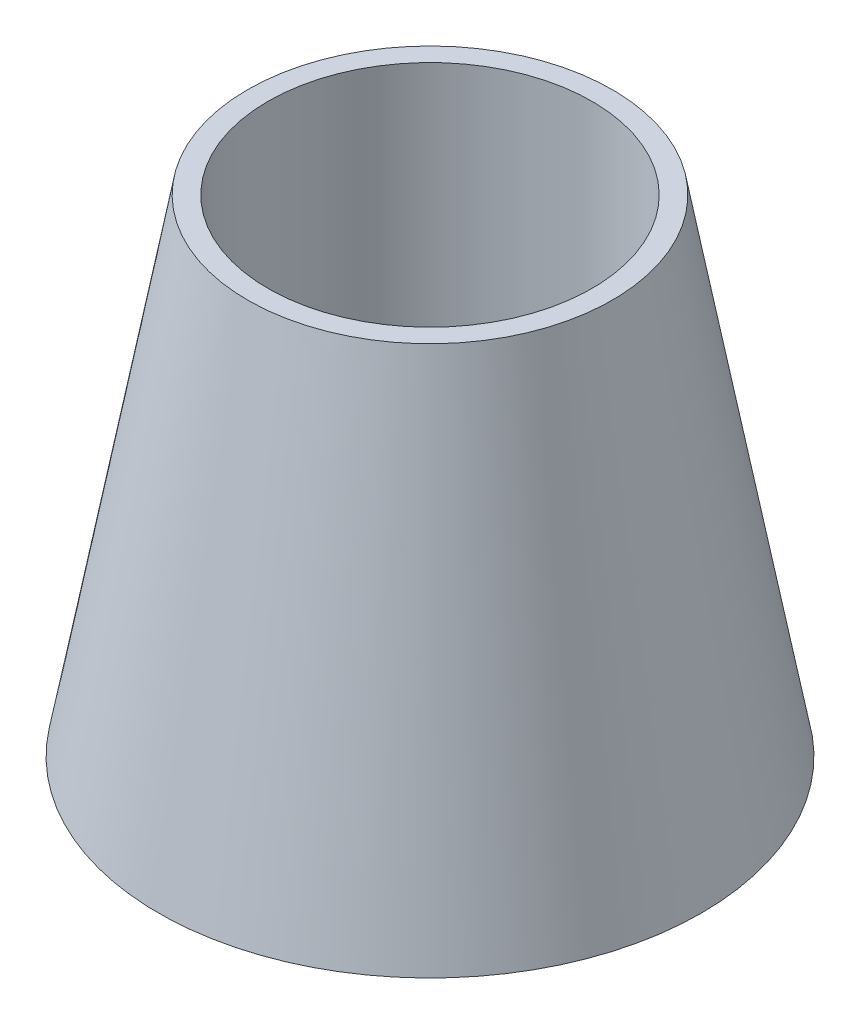
ISO-10303-21;
HEADER;
FILE_DESCRIPTION(('STEP AP214'),'2;1');
FILE_NAME('part.step','',(''),(''),'','','');
FILE_SCHEMA(('AUTOMOTIVE_DESIGN { 1 0 10303 214 1 1 1 1 }'));
ENDSEC;
DATA;
#1=APPLICATION_CONTEXT('core data for automotive mechanical design processes');
#2=APPLICATION_PROTOCOL_DEFINITION('international standard','automotive_design',2000,#1);
#3=PRODUCT_CONTEXT('',#1,'mechanical');
#4=PRODUCT('Part','Part','',(#3));
#5=PRODUCT_RELATED_PRODUCT_CATEGORY('part','',(#4));
#6=PRODUCT_DEFINITION_FORMATION('','',#4);
#7=PRODUCT_DEFINITION_CONTEXT('part definition',#1,'design');
#8=PRODUCT_DEFINITION('design','',#6,#7);
#9=PRODUCT_DEFINITION_SHAPE('','',#8);
#10=(LENGTH_UNIT() NAMED_UNIT(*) SI_UNIT(.MILLI.,.METRE.));
#11=(NAMED_UNIT(*) PLANE_ANGLE_UNIT() SI_UNIT($,.RADIAN.));
#12=(NAMED_UNIT(*) SI_UNIT($,.STERADIAN.) SOLID_ANGLE_UNIT());
#13=UNCERTAINTY_MEASURE_WITH_UNIT(LENGTH_MEASURE(1.E-05),#10,'distance_accuracy_value','');
#14=(GEOMETRIC_REPRESENTATION_CONTEXT(3) GLOBAL_UNCERTAINTY_ASSIGNED_CONTEXT((#13)) GLOBAL_UNIT_ASSIGNED_CONTEXT((#10,
#11,#12)) REPRESENTATION_CONTEXT('',''));
#15=CARTESIAN_POINT('',(0.,0.,0.));
#16=DIRECTION('',(0.,0.,1.));
#17=DIRECTION('',(1.,0.,0.));
#18=AXIS2_PLACEMENT_3D('',#15,#16,#17);
#19=CARTESIAN_POINT('',(0.,6.35000000000001,0.));
#20=DIRECTION('',(0.,1.,0.));
#21=DIRECTION('',(-1.,0.,0.));
#22=AXIS2_PLACEMENT_3D('',#19,#20,#21);
#23=PLANE('',#22);
#24=CARTESIAN_POINT('',(-25.4,6.35000000000001,0.));
#25=DIRECTION('',(0.,1.,0.));
#26=DIRECTION('',(-1.,0.,0.));
#27=AXIS2_PLACEMENT_3D('',#24,#25,#26);
#28=CIRCLE('',#27,3.175);
#29=CARTESIAN_POINT('',(-28.575,6.35000000000001,0.));
#30=VERTEX_POINT('',#29);
#31=EDGE_CURVE('E82',#30,#30,#28,.T.);
#32=ORIENTED_EDGE('',*,*,#31,.F.);
#33=EDGE_LOOP('',(#32));
#34=FACE_BOUND('',#33,.T.);
#35=CARTESIAN_POINT('',(25.4,6.35000000000001,0.));
#36=DIRECTION('',(0.,1.,0.));
#37=DIRECTION('',(-1.,0.,0.));
#38=AXIS2_PLACEMENT_3D('',#35,#36,#37);
#39=CIRCLE('',#38,3.175);
#40=CARTESIAN_POINT('',(22.225,6.35000000000001,0.));
#41=VERTEX_POINT('',#40);
#42=EDGE_CURVE('E76',#41,#41,#39,.T.);
#43=ORIENTED_EDGE('',*,*,#42,.F.);
#44=EDGE_LOOP('',(#43));
#45=FACE_BOUND('',#44,.T.);
#46=CARTESIAN_POINT('',(0.,6.35000000000001,0.));
#47=DIRECTION('',(0.,1.,0.));
#48=DIRECTION('',(-1.,0.,0.));
#49=AXIS2_PLACEMENT_3D('',#46,#47,#48);
#50=CIRCLE('',#49,3.175);
#51=CARTESIAN_POINT('',(-3.175,6.35000000000001,0.));
#52=VERTEX_POINT('',#51);
#53=EDGE_CURVE('E72',#52,#52,#50,.T.);
#54=ORIENTED_EDGE('',*,*,#53,.F.);
#55=EDGE_LOOP('',(#54));
#56=FACE_BOUND('',#55,.T.);
#57=CARTESIAN_POINT('',(0.,6.34999999999999,0.));
#58=DIRECTION('',(0.,1.,0.));
#59=DIRECTION('',(-1.,0.,0.));
#60=AXIS2_PLACEMENT_3D('',#57,#58,#59);
#61=CIRCLE('',#60,48.26);
#62=CARTESIAN_POINT('',(-48.26,6.34999999999999,0.));
#63=VERTEX_POINT('',#62);
#64=EDGE_CURVE('E10',#63,#63,#61,.T.);
#65=ORIENTED_EDGE('',*,*,#64,.T.);
#66=EDGE_LOOP('',(#65));
#67=FACE_BOUND('',#66,.T.);
#68=ADVANCED_FACE('F34',(#34,#45,#56,#67),#23,.T.);
#69=CARTESIAN_POINT('',(0.,8.89,0.));
#70=DIRECTION('',(0.,1.,0.));
#71=DIRECTION('',(-1.,0.,0.));
#72=AXIS2_PLACEMENT_3D('',#69,#70,#71);
#73=TOROIDAL_SURFACE('',#72,48.26,2.54);
#74=CARTESIAN_POINT('',(0.,8.89000000000001,0.));
#75=DIRECTION('',(0.,1.,0.));
#76=DIRECTION('',(-1.,0.,0.));
#77=AXIS2_PLACEMENT_3D('',#74,#75,#76);
#78=CIRCLE('',#77,50.8);
#79=CARTESIAN_POINT('',(-50.8,8.89,0.));
#80=VERTEX_POINT('',#79);
#81=EDGE_CURVE('E41',#80,#80,#78,.T.);
#82=ORIENTED_EDGE('',*,*,#81,.T.);
#83=EDGE_LOOP('',(#82));
#84=FACE_BOUND('',#83,.T.);
#85=ORIENTED_EDGE('',*,*,#64,.F.);
#86=EDGE_LOOP('',(#85));
#87=FACE_BOUND('',#86,.T.);
#88=ADVANCED_FACE('F95',(#84,#87),#73,.F.);
#89=CARTESIAN_POINT('',(0.,152.4,0.));
#90=DIRECTION('',(0.,1.,0.));
#91=DIRECTION('',(-1.,0.,0.));
#92=AXIS2_PLACEMENT_3D('',#89,#90,#91);
#93=CYLINDRICAL_SURFACE('',#92,50.8);
#94=CARTESIAN_POINT('',(0.,152.4,0.));
#95=DIRECTION('',(0.,1.,0.));
#96=DIRECTION('',(-1.,0.,0.));
#97=AXIS2_PLACEMENT_3D('',#94,#95,#96);
#98=CIRCLE('',#97,50.8);
#99=CARTESIAN_POINT('',(-50.8,152.4,0.));
#100=VERTEX_POINT('',#99);
#101=EDGE_CURVE('E45',#100,#100,#98,.T.);
#102=ORIENTED_EDGE('',*,*,#101,.T.);
#103=EDGE_LOOP('',(#102));
#104=FACE_BOUND('',#103,.T.);
#105=ORIENTED_EDGE('',*,*,#81,.F.);
#106=EDGE_LOOP('',(#105));
#107=FACE_BOUND('',#106,.T.);
#108=ADVANCED_FACE('F144',(#104,#107),#93,.F.);
#109=CARTESIAN_POINT('',(-57.15,152.4,0.));
#110=DIRECTION('',(0.,1.,0.));
#111=DIRECTION('',(-1.,0.,0.));
#112=AXIS2_PLACEMENT_3D('',#109,#110,#111);
#113=PLANE('',#112);
#114=CARTESIAN_POINT('',(0.,152.4,0.));
#115=DIRECTION('',(0.,1.,0.));
#116=DIRECTION('',(-1.,0.,0.));
#117=AXIS2_PLACEMENT_3D('',#114,#115,#116);
#118=CIRCLE('',#117,57.15);
#119=CARTESIAN_POINT('',(-57.15,152.4,0.));
#120=VERTEX_POINT('',#119);
#121=EDGE_CURVE('E49',#120,#120,#118,.T.);
#122=ORIENTED_EDGE('',*,*,#121,.T.);
#123=EDGE_LOOP('',(#122));
#124=FACE_BOUND('',#123,.T.);
#125=ORIENTED_EDGE('',*,*,#101,.F.);
#126=EDGE_LOOP('',(#125));
#127=FACE_BOUND('',#126,.T.);
#128=ADVANCED_FACE('F140',(#124,#127),#113,.T.);
#129=CARTESIAN_POINT('',(0.,152.4,0.));
#130=DIRECTION('',(0.,-1.,0.));
#131=DIRECTION('',(1.,0.,0.));
#132=AXIS2_PLACEMENT_3D('',#129,#130,#131);
#133=CONICAL_SURFACE('',#132,57.15,0.18131977440149);
#134=CARTESIAN_POINT('',(0.,0.,0.));
#135=DIRECTION('',(0.,1.,0.));
#136=DIRECTION('',(-1.,0.,0.));
#137=AXIS2_PLACEMENT_3D('',#134,#135,#136);
#138=CIRCLE('',#137,85.09);
#139=CARTESIAN_POINT('',(-85.09,0.,0.));
#140=VERTEX_POINT('',#139);
#141=EDGE_CURVE('E54',#140,#140,#138,.T.);
#142=ORIENTED_EDGE('',*,*,#141,.T.);
#143=EDGE_LOOP('',(#142));
#144=FACE_BOUND('',#143,.T.);
#145=ORIENTED_EDGE('',*,*,#121,.F.);
#146=EDGE_LOOP('',(#145));
#147=FACE_BOUND('',#146,.T.);
#148=ADVANCED_FACE('F111',(#144,#147),#133,.T.);
#149=CARTESIAN_POINT('',(0.,0.,0.));
#150=DIRECTION('',(0.,-1.,0.));
#151=DIRECTION('',(1.,0.,0.));
#152=AXIS2_PLACEMENT_3D('',#149,#150,#151);
#153=PLANE('',#152);
#154=CARTESIAN_POINT('',(-25.4,0.,0.));
#155=DIRECTION('',(0.,-1.,0.));
#156=DIRECTION('',(1.,0.,0.));
#157=AXIS2_PLACEMENT_3D('',#154,#155,#156);
#158=CIRCLE('',#157,3.175);
#159=CARTESIAN_POINT('',(-22.225,0.,0.));
#160=VERTEX_POINT('',#159);
#161=EDGE_CURVE('E79',#160,#160,#158,.F.);
#162=ORIENTED_EDGE('',*,*,#161,.T.);
#163=EDGE_LOOP('',(#162));
#164=FACE_BOUND('',#163,.T.);
#165=CARTESIAN_POINT('',(25.4,0.,0.));
#166=DIRECTION('',(0.,-1.,0.));
#167=DIRECTION('',(1.,0.,0.));
#168=AXIS2_PLACEMENT_3D('',#165,#166,#167);
#169=CIRCLE('',#168,3.175);
#170=CARTESIAN_POINT('',(28.575,0.,0.));
#171=VERTEX_POINT('',#170);
#172=EDGE_CURVE('E85',#171,#171,#169,.F.);
#173=ORIENTED_EDGE('',*,*,#172,.T.);
#174=EDGE_LOOP('',(#173));
#175=FACE_BOUND('',#174,.T.);
#176=CARTESIAN_POINT('',(0.,0.,0.));
#177=DIRECTION('',(0.,-1.,0.));
#178=DIRECTION('',(1.,0.,0.));
#179=AXIS2_PLACEMENT_3D('',#176,#177,#178);
#180=CIRCLE('',#179,3.175);
#181=CARTESIAN_POINT('',(3.175,0.,0.));
#182=VERTEX_POINT('',#181);
#183=EDGE_CURVE('E73',#182,#182,#180,.F.);
#184=ORIENTED_EDGE('',*,*,#183,.T.);
#185=EDGE_LOOP('',(#184));
#186=FACE_BOUND('',#185,.T.);
#187=ORIENTED_EDGE('',*,*,#141,.F.);
#188=EDGE_LOOP('',(#187));
#189=FACE_BOUND('',#188,.T.);
#190=ADVANCED_FACE('F101',(#164,#175,#186,#189),#153,.T.);
#191=CARTESIAN_POINT('',(0.,-0.00100000000001748,0.));
#192=DIRECTION('',(0.,1.,0.));
#193=DIRECTION('',(-1.,0.,0.));
#194=AXIS2_PLACEMENT_3D('',#191,#192,#193);
#195=CYLINDRICAL_SURFACE('',#194,3.175);
#196=ORIENTED_EDGE('',*,*,#183,.F.);
#197=EDGE_LOOP('',(#196));
#198=FACE_BOUND('',#197,.T.);
#199=ORIENTED_EDGE('',*,*,#53,.T.);
#200=EDGE_LOOP('',(#199));
#201=FACE_BOUND('',#200,.T.);
#202=ADVANCED_FACE('F99',(#198,#201),#195,.F.);
#203=CARTESIAN_POINT('',(25.4,-0.00100000000001488,0.));
#204=DIRECTION('',(0.,1.,0.));
#205=DIRECTION('',(-1.,0.,0.));
#206=AXIS2_PLACEMENT_3D('',#203,#204,#205);
#207=CYLINDRICAL_SURFACE('',#206,3.175);
#208=ORIENTED_EDGE('',*,*,#172,.F.);
#209=EDGE_LOOP('',(#208));
#210=FACE_BOUND('',#209,.T.);
#211=ORIENTED_EDGE('',*,*,#42,.T.);
#212=EDGE_LOOP('',(#211));
#213=FACE_BOUND('',#212,.T.);
#214=ADVANCED_FACE('F91',(#210,#213),#207,.F.);
#215=CARTESIAN_POINT('',(-25.4,-0.00100000000002008,0.));
#216=DIRECTION('',(0.,1.,0.));
#217=DIRECTION('',(-1.,0.,0.));
#218=AXIS2_PLACEMENT_3D('',#215,#216,#217);
#219=CYLINDRICAL_SURFACE('',#218,3.175);
#220=ORIENTED_EDGE('',*,*,#161,.F.);
#221=EDGE_LOOP('',(#220));
#222=FACE_BOUND('',#221,.T.);
#223=ORIENTED_EDGE('',*,*,#31,.T.);
#224=EDGE_LOOP('',(#223));
#225=FACE_BOUND('',#224,.T.);
#226=ADVANCED_FACE('F108',(#222,#225),#219,.F.);
#227=CLOSED_SHELL('',(#68,#88,#108,#128,#148,#190,#202,#214,#226));
#228=CARTESIAN_POINT('',(0.,117.763636363636,0.));
#229=DIRECTION('',(0.,-1.,0.));
#230=DIRECTION('',(1.,0.,0.));
#231=AXIS2_PLACEMENT_3D('',#228,#229,#230);
#232=CONICAL_SURFACE('',#231,57.15,0.18131977440149);
#233=CARTESIAN_POINT('',(0.,9.34803278688526,0.));
#234=DIRECTION('',(0.,1.,0.));
#235=DIRECTION('',(-1.,0.,0.));
#236=AXIS2_PLACEMENT_3D('',#233,#234,#235);
#237=CIRCLE('',#236,77.026193989071);
#238=CARTESIAN_POINT('',(-77.026193989071,9.34803278688525,0.));
#239=VERTEX_POINT('',#238);
#240=EDGE_CURVE('E69',#239,#239,#237,.T.);
#241=ORIENTED_EDGE('',*,*,#240,.F.);
#242=EDGE_LOOP('',(#241));
#243=FACE_BOUND('',#242,.T.);
#244=CARTESIAN_POINT('',(0.,117.763636363636,0.));
#245=DIRECTION('',(0.,1.,0.));
#246=DIRECTION('',(-1.,0.,0.));
#247=AXIS2_PLACEMENT_3D('',#244,#245,#246);
#248=CIRCLE('',#247,57.15);
#249=CARTESIAN_POINT('',(-57.15,117.763636363636,0.));
#250=VERTEX_POINT('',#249);
#251=EDGE_CURVE('E57',#250,#250,#248,.T.);
#252=ORIENTED_EDGE('',*,*,#251,.T.);
#253=EDGE_LOOP('',(#252));
#254=FACE_BOUND('',#253,.T.);
#255=ADVANCED_FACE('F133',(#243,#254),#232,.F.);
#256=CARTESIAN_POINT('',(0.,152.4,0.));
#257=DIRECTION('',(0.,1.,0.));
#258=DIRECTION('',(-1.,0.,0.));
#259=AXIS2_PLACEMENT_3D('',#256,#257,#258);
#260=CYLINDRICAL_SURFACE('',#259,57.15);
#261=ORIENTED_EDGE('',*,*,#251,.F.);
#262=EDGE_LOOP('',(#261));
#263=FACE_BOUND('',#262,.T.);
#264=CARTESIAN_POINT('',(0.,8.89000000000001,0.));
#265=DIRECTION('',(0.,1.,0.));
#266=DIRECTION('',(-1.,0.,0.));
#267=AXIS2_PLACEMENT_3D('',#264,#265,#266);
#268=CIRCLE('',#267,57.15);
#269=CARTESIAN_POINT('',(-57.15,8.89,0.));
#270=VERTEX_POINT('',#269);
#271=EDGE_CURVE('E60',#270,#270,#268,.T.);
#272=ORIENTED_EDGE('',*,*,#271,.T.);
#273=EDGE_LOOP('',(#272));
#274=FACE_BOUND('',#273,.T.);
#275=ADVANCED_FACE('F129',(#263,#274),#260,.T.);
#276=CARTESIAN_POINT('',(0.,8.89,0.));
#277=DIRECTION('',(0.,1.,0.));
#278=DIRECTION('',(-1.,0.,0.));
#279=AXIS2_PLACEMENT_3D('',#276,#277,#278);
#280=TOROIDAL_SURFACE('',#279,59.69,2.54);
#281=ORIENTED_EDGE('',*,*,#271,.F.);
#282=EDGE_LOOP('',(#281));
#283=FACE_BOUND('',#282,.T.);
#284=CARTESIAN_POINT('',(0.,6.34999999999999,0.));
#285=DIRECTION('',(0.,1.,0.));
#286=DIRECTION('',(-1.,0.,0.));
#287=AXIS2_PLACEMENT_3D('',#284,#285,#286);
#288=CIRCLE('',#287,59.69);
#289=CARTESIAN_POINT('',(-59.69,6.34999999999999,0.));
#290=VERTEX_POINT('',#289);
#291=EDGE_CURVE('E63',#290,#290,#288,.T.);
#292=ORIENTED_EDGE('',*,*,#291,.T.);
#293=EDGE_LOOP('',(#292));
#294=FACE_BOUND('',#293,.T.);
#295=ADVANCED_FACE('F125',(#283,#294),#280,.F.);
#296=CARTESIAN_POINT('',(-59.69,6.35,0.));
#297=DIRECTION('',(0.,-1.,0.));
#298=DIRECTION('',(1.,0.,0.));
#299=AXIS2_PLACEMENT_3D('',#296,#297,#298);
#300=PLANE('',#299);
#301=ORIENTED_EDGE('',*,*,#291,.F.);
#302=EDGE_LOOP('',(#301));
#303=FACE_BOUND('',#302,.T.);
#304=CARTESIAN_POINT('',(0.,6.34999999999999,0.));
#305=DIRECTION('',(0.,1.,0.));
#306=DIRECTION('',(-1.,0.,0.));
#307=AXIS2_PLACEMENT_3D('',#304,#305,#306);
#308=CIRCLE('',#307,74.5278333333333);
#309=CARTESIAN_POINT('',(-74.5278333333333,6.34999999999999,0.));
#310=VERTEX_POINT('',#309);
#311=EDGE_CURVE('E66',#310,#310,#308,.T.);
#312=ORIENTED_EDGE('',*,*,#311,.T.);
#313=EDGE_LOOP('',(#312));
#314=FACE_BOUND('',#313,.T.);
#315=ADVANCED_FACE('F120',(#303,#314),#300,.F.);
#316=CARTESIAN_POINT('',(0.,8.89,0.));
#317=DIRECTION('',(0.,1.,0.));
#318=DIRECTION('',(-1.,0.,0.));
#319=AXIS2_PLACEMENT_3D('',#316,#317,#318);
#320=TOROIDAL_SURFACE('',#319,74.5278333333333,2.54);
#321=ORIENTED_EDGE('',*,*,#311,.F.);
#322=EDGE_LOOP('',(#321));
#323=FACE_BOUND('',#322,.T.);
#324=ORIENTED_EDGE('',*,*,#240,.T.);
#325=EDGE_LOOP('',(#324));
#326=FACE_BOUND('',#325,.T.);
#327=ADVANCED_FACE('F117',(#323,#326),#320,.F.);
#328=CLOSED_SHELL('',(#255,#275,#295,#315,#327));
#329=ORIENTED_CLOSED_SHELL('',*,#328,.T.);
#330=BREP_WITH_VOIDS('B2',#227,(#329));
#331=ADVANCED_BREP_SHAPE_REPRESENTATION('',(#18,#330),#14);
#332=SHAPE_DEFINITION_REPRESENTATION(#9,#331);
ENDSEC;
END-ISO-10303-21;
